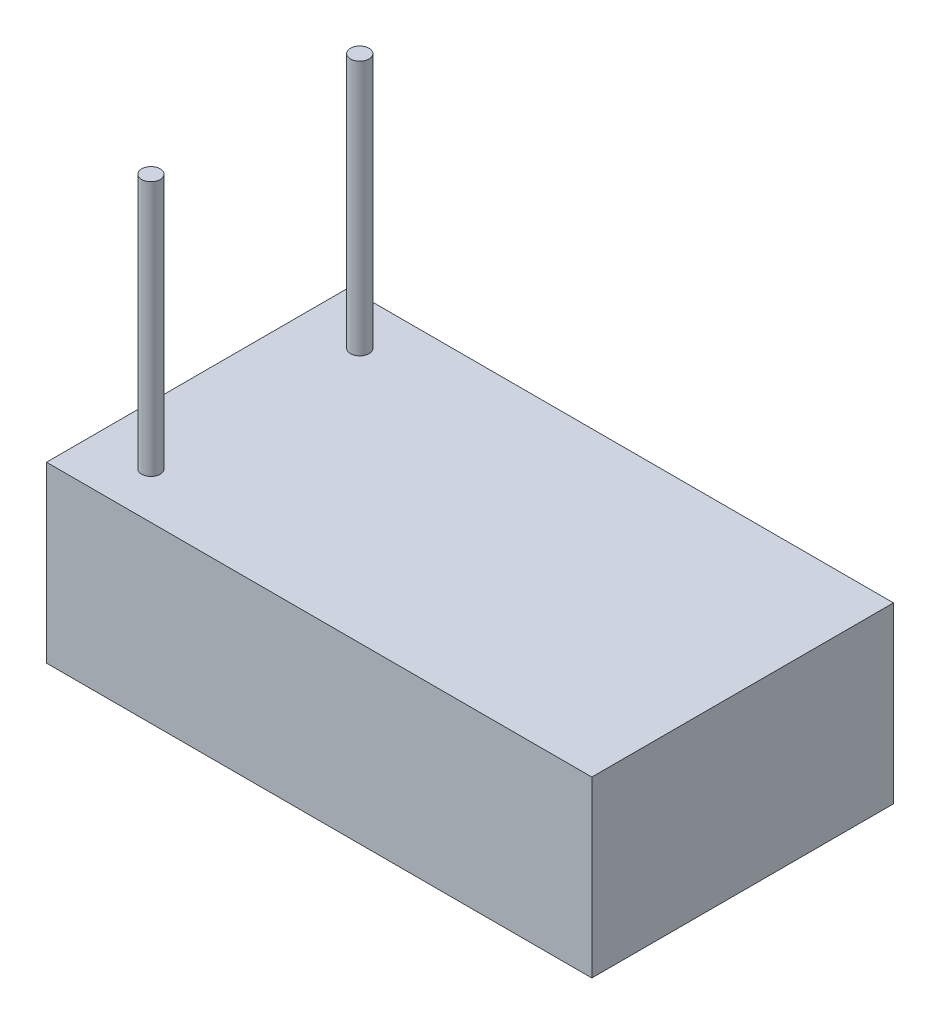
ISO-10303-21;
HEADER;
FILE_DESCRIPTION(('STEP AP214'),'2;1');
FILE_NAME('part.step','',(''),(''),'','','');
FILE_SCHEMA(('AUTOMOTIVE_DESIGN { 1 0 10303 214 1 1 1 1 }'));
ENDSEC;
DATA;
#1=APPLICATION_CONTEXT('core data for automotive mechanical design processes');
#2=APPLICATION_PROTOCOL_DEFINITION('international standard','automotive_design',2000,#1);
#3=PRODUCT_CONTEXT('',#1,'mechanical');
#4=PRODUCT('Part','Part','',(#3));
#5=PRODUCT_RELATED_PRODUCT_CATEGORY('part','',(#4));
#6=PRODUCT_DEFINITION_FORMATION('','',#4);
#7=PRODUCT_DEFINITION_CONTEXT('part definition',#1,'design');
#8=PRODUCT_DEFINITION('design','',#6,#7);
#9=PRODUCT_DEFINITION_SHAPE('','',#8);
#10=(LENGTH_UNIT() NAMED_UNIT(*) SI_UNIT(.MILLI.,.METRE.));
#11=(NAMED_UNIT(*) PLANE_ANGLE_UNIT() SI_UNIT($,.RADIAN.));
#12=(NAMED_UNIT(*) SI_UNIT($,.STERADIAN.) SOLID_ANGLE_UNIT());
#13=UNCERTAINTY_MEASURE_WITH_UNIT(LENGTH_MEASURE(1.E-05),#10,'distance_accuracy_value','');
#14=(GEOMETRIC_REPRESENTATION_CONTEXT(3) GLOBAL_UNCERTAINTY_ASSIGNED_CONTEXT((#13)) GLOBAL_UNIT_ASSIGNED_CONTEXT((#10,
#11,#12)) REPRESENTATION_CONTEXT('',''));
#15=CARTESIAN_POINT('',(0.,0.,0.));
#16=DIRECTION('',(0.,0.,1.));
#17=DIRECTION('',(1.,0.,0.));
#18=AXIS2_PLACEMENT_3D('',#15,#16,#17);
#19=CARTESIAN_POINT('',(-23.5,15.,-13.));
#20=DIRECTION('',(1.,0.,0.));
#21=DIRECTION('',(0.,0.,-1.));
#22=AXIS2_PLACEMENT_3D('',#19,#20,#21);
#23=PLANE('',#22);
#24=DIRECTION('',(0.,0.,1.));
#25=VECTOR('',#24,1.);
#26=CARTESIAN_POINT('',(-23.5,0.,-13.));
#27=LINE('',#26,#25);
#28=CARTESIAN_POINT('',(-23.5,0.,-13.));
#29=VERTEX_POINT('',#28);
#30=CARTESIAN_POINT('',(-23.5,0.,13.));
#31=VERTEX_POINT('',#30);
#32=EDGE_CURVE('E108',#29,#31,#27,.T.);
#33=ORIENTED_EDGE('',*,*,#32,.T.);
#34=DIRECTION('',(0.,-1.,0.));
#35=VECTOR('',#34,1.);
#36=CARTESIAN_POINT('',(-23.5,15.,13.));
#37=LINE('',#36,#35);
#38=CARTESIAN_POINT('',(-23.5,15.,13.));
#39=VERTEX_POINT('',#38);
#40=EDGE_CURVE('E46',#39,#31,#37,.T.);
#41=ORIENTED_EDGE('',*,*,#40,.F.);
#42=DIRECTION('',(0.,0.,1.));
#43=VECTOR('',#42,1.);
#44=CARTESIAN_POINT('',(-23.5,15.,-13.));
#45=LINE('',#44,#43);
#46=CARTESIAN_POINT('',(-23.5,15.,-13.));
#47=VERTEX_POINT('',#46);
#48=EDGE_CURVE('E96',#47,#39,#45,.T.);
#49=ORIENTED_EDGE('',*,*,#48,.F.);
#50=DIRECTION('',(0.,-1.,0.));
#51=VECTOR('',#50,1.);
#52=CARTESIAN_POINT('',(-23.5,15.,-13.));
#53=LINE('',#52,#51);
#54=EDGE_CURVE('E104',#47,#29,#53,.T.);
#55=ORIENTED_EDGE('',*,*,#54,.T.);
#56=EDGE_LOOP('',(#33,#41,#49,#55));
#57=FACE_BOUND('',#56,.T.);
#58=ADVANCED_FACE('F43',(#57),#23,.F.);
#59=CARTESIAN_POINT('',(-23.5,15.,13.));
#60=DIRECTION('',(0.,0.,-1.));
#61=DIRECTION('',(-1.,0.,0.));
#62=AXIS2_PLACEMENT_3D('',#59,#60,#61);
#63=PLANE('',#62);
#64=DIRECTION('',(1.,0.,0.));
#65=VECTOR('',#64,1.);
#66=CARTESIAN_POINT('',(-23.5,0.,13.));
#67=LINE('',#66,#65);
#68=CARTESIAN_POINT('',(23.5,0.,13.));
#69=VERTEX_POINT('',#68);
#70=EDGE_CURVE('E101',#31,#69,#67,.T.);
#71=ORIENTED_EDGE('',*,*,#70,.T.);
#72=DIRECTION('',(0.,-1.,0.));
#73=VECTOR('',#72,1.);
#74=CARTESIAN_POINT('',(23.5,15.,13.));
#75=LINE('',#74,#73);
#76=CARTESIAN_POINT('',(23.5,15.,13.));
#77=VERTEX_POINT('',#76);
#78=EDGE_CURVE('E97',#77,#69,#75,.T.);
#79=ORIENTED_EDGE('',*,*,#78,.F.);
#80=DIRECTION('',(1.,0.,0.));
#81=VECTOR('',#80,1.);
#82=CARTESIAN_POINT('',(-23.5,15.,13.));
#83=LINE('',#82,#81);
#84=EDGE_CURVE('E93',#39,#77,#83,.T.);
#85=ORIENTED_EDGE('',*,*,#84,.F.);
#86=ORIENTED_EDGE('',*,*,#40,.T.);
#87=EDGE_LOOP('',(#71,#79,#85,#86));
#88=FACE_BOUND('',#87,.T.);
#89=ADVANCED_FACE('F99',(#88),#63,.F.);
#90=CARTESIAN_POINT('',(23.5,15.,13.));
#91=DIRECTION('',(-1.,0.,0.));
#92=DIRECTION('',(0.,0.,1.));
#93=AXIS2_PLACEMENT_3D('',#90,#91,#92);
#94=PLANE('',#93);
#95=DIRECTION('',(0.,0.,-1.));
#96=VECTOR('',#95,1.);
#97=CARTESIAN_POINT('',(23.5,0.,13.));
#98=LINE('',#97,#96);
#99=CARTESIAN_POINT('',(23.5,0.,-13.));
#100=VERTEX_POINT('',#99);
#101=EDGE_CURVE('E80',#69,#100,#98,.T.);
#102=ORIENTED_EDGE('',*,*,#101,.T.);
#103=DIRECTION('',(0.,-1.,0.));
#104=VECTOR('',#103,1.);
#105=CARTESIAN_POINT('',(23.5,15.,-13.));
#106=LINE('',#105,#104);
#107=CARTESIAN_POINT('',(23.5,15.,-13.));
#108=VERTEX_POINT('',#107);
#109=EDGE_CURVE('E105',#108,#100,#106,.T.);
#110=ORIENTED_EDGE('',*,*,#109,.F.);
#111=DIRECTION('',(0.,0.,-1.));
#112=VECTOR('',#111,1.);
#113=CARTESIAN_POINT('',(23.5,15.,13.));
#114=LINE('',#113,#112);
#115=EDGE_CURVE('E94',#77,#108,#114,.T.);
#116=ORIENTED_EDGE('',*,*,#115,.F.);
#117=ORIENTED_EDGE('',*,*,#78,.T.);
#118=EDGE_LOOP('',(#102,#110,#116,#117));
#119=FACE_BOUND('',#118,.T.);
#120=ADVANCED_FACE('F103',(#119),#94,.F.);
#121=CARTESIAN_POINT('',(23.5,15.,-13.));
#122=DIRECTION('',(0.,0.,1.));
#123=DIRECTION('',(1.,0.,0.));
#124=AXIS2_PLACEMENT_3D('',#121,#122,#123);
#125=PLANE('',#124);
#126=DIRECTION('',(-1.,0.,0.));
#127=VECTOR('',#126,1.);
#128=CARTESIAN_POINT('',(23.5,0.,-13.));
#129=LINE('',#128,#127);
#130=EDGE_CURVE('E83',#100,#29,#129,.T.);
#131=ORIENTED_EDGE('',*,*,#130,.T.);
#132=ORIENTED_EDGE('',*,*,#54,.F.);
#133=DIRECTION('',(-1.,0.,0.));
#134=VECTOR('',#133,1.);
#135=CARTESIAN_POINT('',(23.5,15.,-13.));
#136=LINE('',#135,#134);
#137=EDGE_CURVE('E58',#108,#47,#136,.T.);
#138=ORIENTED_EDGE('',*,*,#137,.F.);
#139=ORIENTED_EDGE('',*,*,#109,.T.);
#140=EDGE_LOOP('',(#131,#132,#138,#139));
#141=FACE_BOUND('',#140,.T.);
#142=ADVANCED_FACE('F120',(#141),#125,.F.);
#143=CARTESIAN_POINT('',(0.,15.,0.));
#144=DIRECTION('',(0.,1.,0.));
#145=DIRECTION('',(0.,0.,1.));
#146=AXIS2_PLACEMENT_3D('',#143,#144,#145);
#147=PLANE('',#146);
#148=CARTESIAN_POINT('',(-18.5,15.,9.));
#149=DIRECTION('',(0.,1.,0.));
#150=DIRECTION('',(0.,0.,1.));
#151=AXIS2_PLACEMENT_3D('',#148,#149,#150);
#152=CIRCLE('',#151,0.799999999999999);
#153=CARTESIAN_POINT('',(-18.5,15.,9.8));
#154=VERTEX_POINT('',#153);
#155=EDGE_CURVE('E127',#154,#154,#152,.T.);
#156=ORIENTED_EDGE('',*,*,#155,.F.);
#157=EDGE_LOOP('',(#156));
#158=FACE_BOUND('',#157,.T.);
#159=CARTESIAN_POINT('',(-18.5,15.,-9.));
#160=DIRECTION('',(0.,1.,0.));
#161=DIRECTION('',(0.,0.,1.));
#162=AXIS2_PLACEMENT_3D('',#159,#160,#161);
#163=CIRCLE('',#162,0.799999999999999);
#164=CARTESIAN_POINT('',(-18.5,15.,-8.2));
#165=VERTEX_POINT('',#164);
#166=EDGE_CURVE('E11',#165,#165,#163,.T.);
#167=ORIENTED_EDGE('',*,*,#166,.F.);
#168=EDGE_LOOP('',(#167));
#169=FACE_BOUND('',#168,.T.);
#170=ORIENTED_EDGE('',*,*,#48,.T.);
#171=ORIENTED_EDGE('',*,*,#84,.T.);
#172=ORIENTED_EDGE('',*,*,#115,.T.);
#173=ORIENTED_EDGE('',*,*,#137,.T.);
#174=EDGE_LOOP('',(#170,#171,#172,#173));
#175=FACE_BOUND('',#174,.T.);
#176=ADVANCED_FACE('F95',(#158,#169,#175),#147,.T.);
#177=CARTESIAN_POINT('',(0.,0.,0.));
#178=DIRECTION('',(0.,1.,0.));
#179=DIRECTION('',(0.,0.,1.));
#180=AXIS2_PLACEMENT_3D('',#177,#178,#179);
#181=PLANE('',#180);
#182=ORIENTED_EDGE('',*,*,#32,.F.);
#183=ORIENTED_EDGE('',*,*,#130,.F.);
#184=ORIENTED_EDGE('',*,*,#101,.F.);
#185=ORIENTED_EDGE('',*,*,#70,.F.);
#186=EDGE_LOOP('',(#182,#183,#184,#185));
#187=FACE_BOUND('',#186,.T.);
#188=ADVANCED_FACE('F118',(#187),#181,.F.);
#189=CARTESIAN_POINT('',(-18.5,37.,-9.));
#190=DIRECTION('',(0.,-1.,0.));
#191=DIRECTION('',(0.,0.,-1.));
#192=AXIS2_PLACEMENT_3D('',#189,#190,#191);
#193=CYLINDRICAL_SURFACE('',#192,0.799999999999999);
#194=CARTESIAN_POINT('',(-18.5,37.,-9.));
#195=DIRECTION('',(0.,1.,0.));
#196=DIRECTION('',(0.,0.,1.));
#197=AXIS2_PLACEMENT_3D('',#194,#195,#196);
#198=CIRCLE('',#197,0.799999999999999);
#199=CARTESIAN_POINT('',(-18.5,37.,-8.2));
#200=VERTEX_POINT('',#199);
#201=EDGE_CURVE('E115',#200,#200,#198,.T.);
#202=ORIENTED_EDGE('',*,*,#201,.F.);
#203=EDGE_LOOP('',(#202));
#204=FACE_BOUND('',#203,.T.);
#205=ORIENTED_EDGE('',*,*,#166,.T.);
#206=EDGE_LOOP('',(#205));
#207=FACE_BOUND('',#206,.T.);
#208=ADVANCED_FACE('F148',(#204,#207),#193,.T.);
#209=CARTESIAN_POINT('',(-18.5,37.,-9.));
#210=DIRECTION('',(0.,1.,0.));
#211=DIRECTION('',(0.,0.,1.));
#212=AXIS2_PLACEMENT_3D('',#209,#210,#211);
#213=PLANE('',#212);
#214=ORIENTED_EDGE('',*,*,#201,.T.);
#215=EDGE_LOOP('',(#214));
#216=FACE_BOUND('',#215,.T.);
#217=ADVANCED_FACE('F140',(#216),#213,.T.);
#218=CARTESIAN_POINT('',(-18.5,37.,9.));
#219=DIRECTION('',(0.,-1.,0.));
#220=DIRECTION('',(0.,0.,-1.));
#221=AXIS2_PLACEMENT_3D('',#218,#219,#220);
#222=CYLINDRICAL_SURFACE('',#221,0.799999999999999);
#223=CARTESIAN_POINT('',(-18.5,37.,9.));
#224=DIRECTION('',(0.,1.,0.));
#225=DIRECTION('',(0.,0.,1.));
#226=AXIS2_PLACEMENT_3D('',#223,#224,#225);
#227=CIRCLE('',#226,0.799999999999999);
#228=CARTESIAN_POINT('',(-18.5,37.,9.8));
#229=VERTEX_POINT('',#228);
#230=EDGE_CURVE('E121',#229,#229,#227,.T.);
#231=ORIENTED_EDGE('',*,*,#230,.F.);
#232=EDGE_LOOP('',(#231));
#233=FACE_BOUND('',#232,.T.);
#234=ORIENTED_EDGE('',*,*,#155,.T.);
#235=EDGE_LOOP('',(#234));
#236=FACE_BOUND('',#235,.T.);
#237=ADVANCED_FACE('F131',(#233,#236),#222,.T.);
#238=CARTESIAN_POINT('',(-18.5,37.,9.));
#239=DIRECTION('',(0.,1.,0.));
#240=DIRECTION('',(0.,0.,1.));
#241=AXIS2_PLACEMENT_3D('',#238,#239,#240);
#242=PLANE('',#241);
#243=ORIENTED_EDGE('',*,*,#230,.T.);
#244=EDGE_LOOP('',(#243));
#245=FACE_BOUND('',#244,.T.);
#246=ADVANCED_FACE('F135',(#245),#242,.T.);
#247=CLOSED_SHELL('',(#58,#89,#120,#142,#176,#188,#208,#217,#237,#246));
#248=MANIFOLD_SOLID_BREP('B2',#247);
#249=ADVANCED_BREP_SHAPE_REPRESENTATION('',(#18,#248),#14);
#250=SHAPE_DEFINITION_REPRESENTATION(#9,#249);
ENDSEC;
END-ISO-10303-21;
